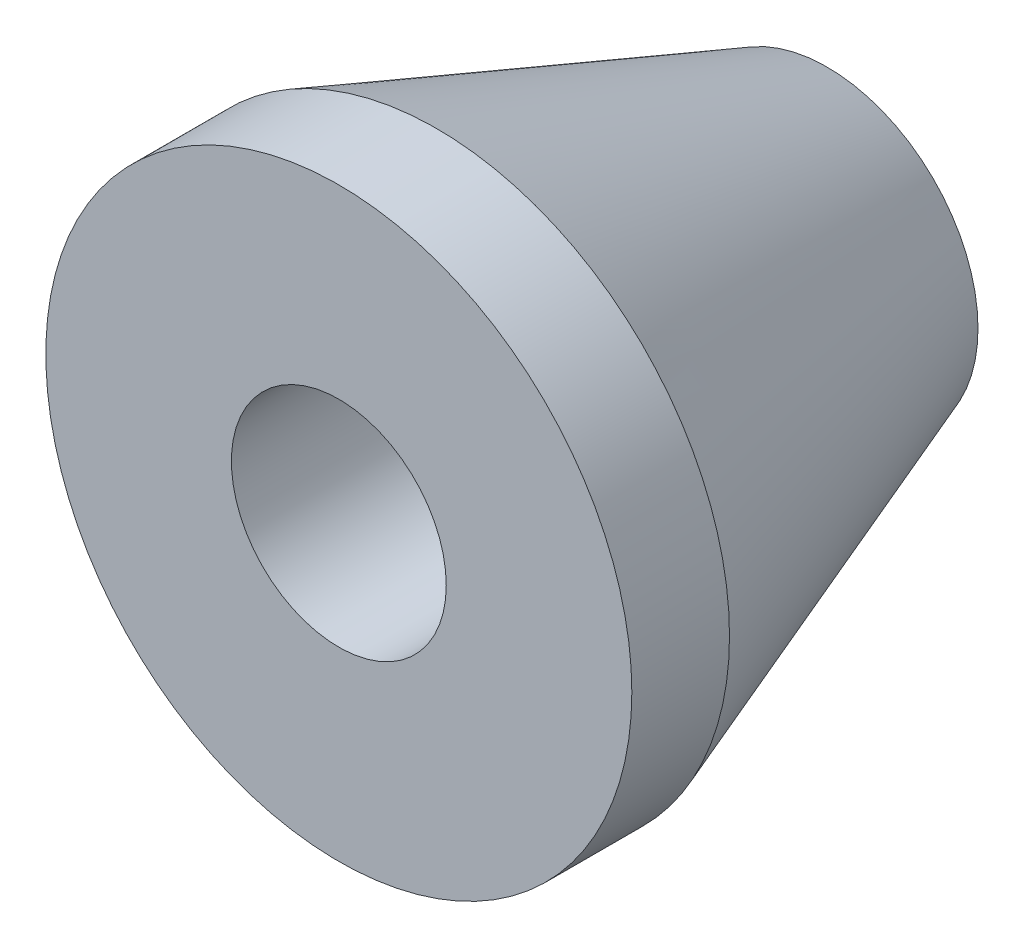
ISO-10303-21;
HEADER;
FILE_DESCRIPTION(('STEP AP214'),'2;1');
FILE_NAME('part.step','',(''),(''),'','','');
FILE_SCHEMA(('AUTOMOTIVE_DESIGN { 1 0 10303 214 1 1 1 1 }'));
ENDSEC;
DATA;
#1=APPLICATION_CONTEXT('core data for automotive mechanical design processes');
#2=APPLICATION_PROTOCOL_DEFINITION('international standard','automotive_design',2000,#1);
#3=PRODUCT_CONTEXT('',#1,'mechanical');
#4=PRODUCT('Part','Part','',(#3));
#5=PRODUCT_RELATED_PRODUCT_CATEGORY('part','',(#4));
#6=PRODUCT_DEFINITION_FORMATION('','',#4);
#7=PRODUCT_DEFINITION_CONTEXT('part definition',#1,'design');
#8=PRODUCT_DEFINITION('design','',#6,#7);
#9=PRODUCT_DEFINITION_SHAPE('','',#8);
#10=(LENGTH_UNIT() NAMED_UNIT(*) SI_UNIT(.MILLI.,.METRE.));
#11=(NAMED_UNIT(*) PLANE_ANGLE_UNIT() SI_UNIT($,.RADIAN.));
#12=(NAMED_UNIT(*) SI_UNIT($,.STERADIAN.) SOLID_ANGLE_UNIT());
#13=UNCERTAINTY_MEASURE_WITH_UNIT(LENGTH_MEASURE(1.E-05),#10,'distance_accuracy_value','');
#14=(GEOMETRIC_REPRESENTATION_CONTEXT(3) GLOBAL_UNCERTAINTY_ASSIGNED_CONTEXT((#13)) GLOBAL_UNIT_ASSIGNED_CONTEXT((#10,
#11,#12)) REPRESENTATION_CONTEXT('',''));
#15=CARTESIAN_POINT('',(0.,0.,0.));
#16=DIRECTION('',(0.,0.,1.));
#17=DIRECTION('',(1.,0.,0.));
#18=AXIS2_PLACEMENT_3D('',#15,#16,#17);
#19=CARTESIAN_POINT('',(0.,0.,33.8109373216121));
#20=DIRECTION('',(0.,0.,1.));
#21=DIRECTION('',(1.,0.,0.));
#22=AXIS2_PLACEMENT_3D('',#19,#20,#21);
#23=CYLINDRICAL_SURFACE('',#22,11.);
#24=CARTESIAN_POINT('',(0.,0.,-50.));
#25=DIRECTION('',(0.,0.,1.));
#26=DIRECTION('',(1.,0.,0.));
#27=AXIS2_PLACEMENT_3D('',#24,#25,#26);
#28=CIRCLE('',#27,11.);
#29=CARTESIAN_POINT('',(11.,0.,-50.));
#30=VERTEX_POINT('',#29);
#31=EDGE_CURVE('E57',#30,#30,#28,.T.);
#32=ORIENTED_EDGE('',*,*,#31,.F.);
#33=EDGE_LOOP('',(#32));
#34=FACE_BOUND('',#33,.T.);
#35=CARTESIAN_POINT('',(0.,0.,0.));
#36=DIRECTION('',(0.,0.,1.));
#37=DIRECTION('',(1.,0.,0.));
#38=AXIS2_PLACEMENT_3D('',#35,#36,#37);
#39=CIRCLE('',#38,11.);
#40=CARTESIAN_POINT('',(11.,0.,0.));
#41=VERTEX_POINT('',#40);
#42=EDGE_CURVE('E10',#41,#41,#39,.T.);
#43=ORIENTED_EDGE('',*,*,#42,.T.);
#44=EDGE_LOOP('',(#43));
#45=FACE_BOUND('',#44,.T.);
#46=ADVANCED_FACE('F38',(#34,#45),#23,.F.);
#47=CARTESIAN_POINT('',(0.,11.,0.));
#48=DIRECTION('',(0.,0.,-1.));
#49=DIRECTION('',(-1.,0.,0.));
#50=AXIS2_PLACEMENT_3D('',#47,#48,#49);
#51=PLANE('',#50);
#52=ORIENTED_EDGE('',*,*,#42,.F.);
#53=EDGE_LOOP('',(#52));
#54=FACE_BOUND('',#53,.T.);
#55=CARTESIAN_POINT('',(0.,0.,0.));
#56=DIRECTION('',(0.,0.,1.));
#57=DIRECTION('',(1.,0.,0.));
#58=AXIS2_PLACEMENT_3D('',#55,#56,#57);
#59=CIRCLE('',#58,30.);
#60=CARTESIAN_POINT('',(30.,0.,0.));
#61=VERTEX_POINT('',#60);
#62=EDGE_CURVE('E44',#61,#61,#59,.T.);
#63=ORIENTED_EDGE('',*,*,#62,.T.);
#64=EDGE_LOOP('',(#63));
#65=FACE_BOUND('',#64,.T.);
#66=ADVANCED_FACE('F64',(#54,#65),#51,.F.);
#67=CARTESIAN_POINT('',(0.,0.,33.8109373216121));
#68=DIRECTION('',(0.,0.,1.));
#69=DIRECTION('',(1.,0.,0.));
#70=AXIS2_PLACEMENT_3D('',#67,#68,#69);
#71=CYLINDRICAL_SURFACE('',#70,30.);
#72=ORIENTED_EDGE('',*,*,#62,.F.);
#73=EDGE_LOOP('',(#72));
#74=FACE_BOUND('',#73,.T.);
#75=CARTESIAN_POINT('',(0.,0.,-10.));
#76=DIRECTION('',(0.,0.,1.));
#77=DIRECTION('',(1.,0.,0.));
#78=AXIS2_PLACEMENT_3D('',#75,#76,#77);
#79=CIRCLE('',#78,30.);
#80=CARTESIAN_POINT('',(30.,0.,-10.));
#81=VERTEX_POINT('',#80);
#82=EDGE_CURVE('E48',#81,#81,#79,.T.);
#83=ORIENTED_EDGE('',*,*,#82,.T.);
#84=EDGE_LOOP('',(#83));
#85=FACE_BOUND('',#84,.T.);
#86=ADVANCED_FACE('F68',(#74,#85),#71,.T.);
#87=CARTESIAN_POINT('',(0.,0.,-50.));
#88=DIRECTION('',(0.,0.,1.));
#89=DIRECTION('',(1.,0.,0.));
#90=AXIS2_PLACEMENT_3D('',#87,#88,#89);
#91=CONICAL_SURFACE('',#90,15.4411906293519,0.349065850398867);
#92=ORIENTED_EDGE('',*,*,#82,.F.);
#93=EDGE_LOOP('',(#92));
#94=FACE_BOUND('',#93,.T.);
#95=CARTESIAN_POINT('',(0.,0.,-50.));
#96=DIRECTION('',(0.,0.,1.));
#97=DIRECTION('',(1.,0.,0.));
#98=AXIS2_PLACEMENT_3D('',#95,#96,#97);
#99=CIRCLE('',#98,15.4411906293519);
#100=CARTESIAN_POINT('',(15.4411906293519,0.,-50.));
#101=VERTEX_POINT('',#100);
#102=EDGE_CURVE('E52',#101,#101,#99,.T.);
#103=ORIENTED_EDGE('',*,*,#102,.T.);
#104=EDGE_LOOP('',(#103));
#105=FACE_BOUND('',#104,.T.);
#106=ADVANCED_FACE('F73',(#94,#105),#91,.T.);
#107=CARTESIAN_POINT('',(0.,15.4411906293519,-50.));
#108=DIRECTION('',(0.,0.,1.));
#109=DIRECTION('',(1.,0.,0.));
#110=AXIS2_PLACEMENT_3D('',#107,#108,#109);
#111=PLANE('',#110);
#112=ORIENTED_EDGE('',*,*,#102,.F.);
#113=EDGE_LOOP('',(#112));
#114=FACE_BOUND('',#113,.T.);
#115=ORIENTED_EDGE('',*,*,#31,.T.);
#116=EDGE_LOOP('',(#115));
#117=FACE_BOUND('',#116,.T.);
#118=ADVANCED_FACE('F61',(#114,#117),#111,.F.);
#119=CLOSED_SHELL('',(#46,#66,#86,#106,#118));
#120=MANIFOLD_SOLID_BREP('B2',#119);
#121=ADVANCED_BREP_SHAPE_REPRESENTATION('',(#18,#120),#14);
#122=SHAPE_DEFINITION_REPRESENTATION(#9,#121);
ENDSEC;
END-ISO-10303-21;
